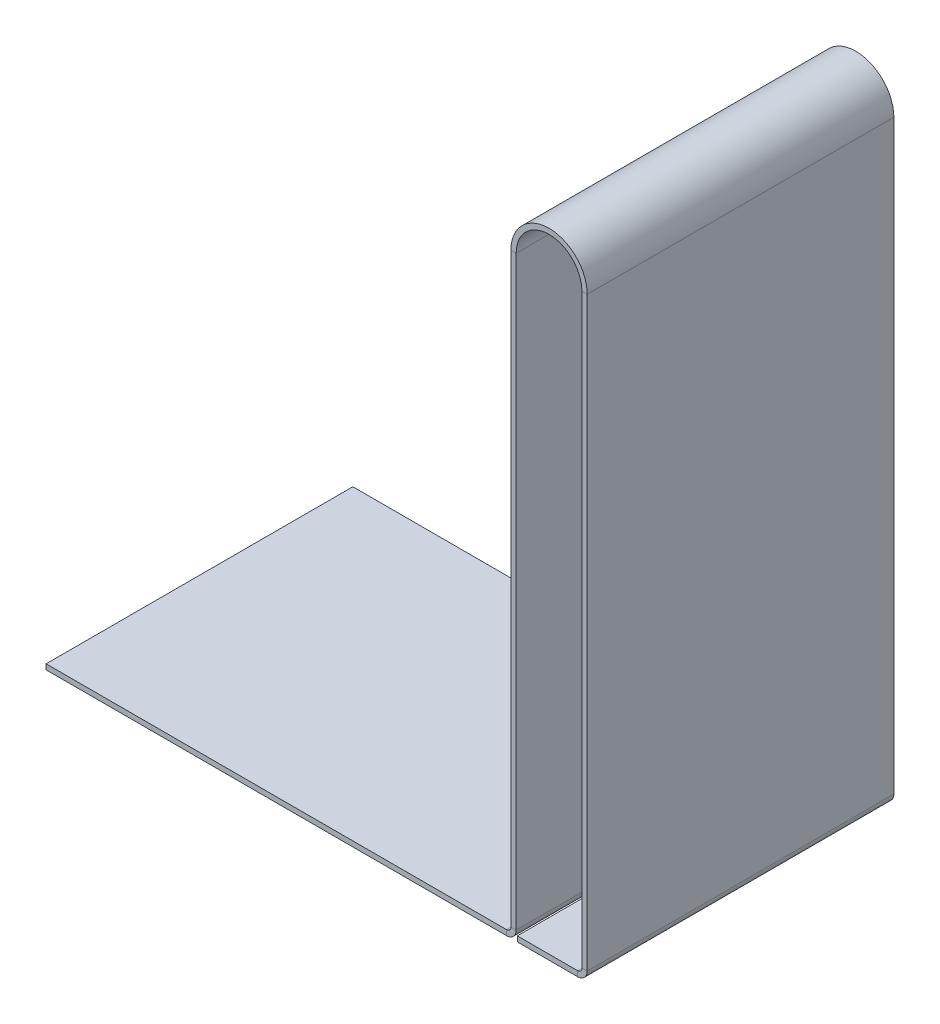
ISO-10303-21;
HEADER;
FILE_DESCRIPTION(('STEP AP214'),'2;1');
FILE_NAME('part.step','',(''),(''),'','','');
FILE_SCHEMA(('AUTOMOTIVE_DESIGN { 1 0 10303 214 1 1 1 1 }'));
ENDSEC;
DATA;
#1=APPLICATION_CONTEXT('core data for automotive mechanical design processes');
#2=APPLICATION_PROTOCOL_DEFINITION('international standard','automotive_design',2000,#1);
#3=PRODUCT_CONTEXT('',#1,'mechanical');
#4=PRODUCT('Part','Part','',(#3));
#5=PRODUCT_RELATED_PRODUCT_CATEGORY('part','',(#4));
#6=PRODUCT_DEFINITION_FORMATION('','',#4);
#7=PRODUCT_DEFINITION_CONTEXT('part definition',#1,'design');
#8=PRODUCT_DEFINITION('design','',#6,#7);
#9=PRODUCT_DEFINITION_SHAPE('','',#8);
#10=(LENGTH_UNIT() NAMED_UNIT(*) SI_UNIT(.MILLI.,.METRE.));
#11=(NAMED_UNIT(*) PLANE_ANGLE_UNIT() SI_UNIT($,.RADIAN.));
#12=(NAMED_UNIT(*) SI_UNIT($,.STERADIAN.) SOLID_ANGLE_UNIT());
#13=UNCERTAINTY_MEASURE_WITH_UNIT(LENGTH_MEASURE(1.E-05),#10,'distance_accuracy_value','');
#14=(GEOMETRIC_REPRESENTATION_CONTEXT(3) GLOBAL_UNCERTAINTY_ASSIGNED_CONTEXT((#13)) GLOBAL_UNIT_ASSIGNED_CONTEXT((#10,
#11,#12)) REPRESENTATION_CONTEXT('',''));
#15=CARTESIAN_POINT('',(0.,0.,0.));
#16=DIRECTION('',(0.,0.,1.));
#17=DIRECTION('',(1.,0.,0.));
#18=AXIS2_PLACEMENT_3D('',#15,#16,#17);
#19=CARTESIAN_POINT('',(-1.2,-75.,-34.99));
#20=DIRECTION('',(0.,0.,-1.));
#21=DIRECTION('',(-1.,0.,0.));
#22=AXIS2_PLACEMENT_3D('',#19,#20,#21);
#23=PLANE('',#22);
#24=DIRECTION('',(0.,1.,0.));
#25=VECTOR('',#24,1.);
#26=CARTESIAN_POINT('',(0.,-75.,-34.99));
#27=LINE('',#26,#25);
#28=CARTESIAN_POINT('',(0.,-58.7433629385641,-34.99));
#29=VERTEX_POINT('',#28);
#30=CARTESIAN_POINT('',(0.,75.,-34.99));
#31=VERTEX_POINT('',#30);
#32=EDGE_CURVE('E287',#29,#31,#27,.T.);
#33=ORIENTED_EDGE('',*,*,#32,.F.);
#34=DIRECTION('',(-1.,0.,0.));
#35=VECTOR('',#34,1.);
#36=CARTESIAN_POINT('',(-1.2,-58.7433629385641,-34.99));
#37=LINE('',#36,#35);
#38=CARTESIAN_POINT('',(-1.2,-58.7433629385641,-34.99));
#39=VERTEX_POINT('',#38);
#40=EDGE_CURVE('E315',#29,#39,#37,.T.);
#41=ORIENTED_EDGE('',*,*,#40,.T.);
#42=DIRECTION('',(0.,1.,0.));
#43=VECTOR('',#42,1.);
#44=CARTESIAN_POINT('',(-1.2,-75.,-34.99));
#45=LINE('',#44,#43);
#46=CARTESIAN_POINT('',(-1.2,75.,-34.99));
#47=VERTEX_POINT('',#46);
#48=EDGE_CURVE('E57',#39,#47,#45,.T.);
#49=ORIENTED_EDGE('',*,*,#48,.T.);
#50=DIRECTION('',(1.,0.,0.));
#51=VECTOR('',#50,1.);
#52=CARTESIAN_POINT('',(-1.2,75.,-34.99));
#53=LINE('',#52,#51);
#54=EDGE_CURVE('E290',#47,#31,#53,.T.);
#55=ORIENTED_EDGE('',*,*,#54,.T.);
#56=EDGE_LOOP('',(#33,#41,#49,#55));
#57=FACE_BOUND('',#56,.T.);
#58=ADVANCED_FACE('F53',(#57),#23,.T.);
#59=CARTESIAN_POINT('',(-1.2,-75.,34.99));
#60=DIRECTION('',(0.,0.,1.));
#61=DIRECTION('',(1.,0.,0.));
#62=AXIS2_PLACEMENT_3D('',#59,#60,#61);
#63=PLANE('',#62);
#64=DIRECTION('',(0.,-1.,0.));
#65=VECTOR('',#64,1.);
#66=CARTESIAN_POINT('',(-1.2,-75.,34.99));
#67=LINE('',#66,#65);
#68=CARTESIAN_POINT('',(-1.2,75.,34.99));
#69=VERTEX_POINT('',#68);
#70=CARTESIAN_POINT('',(-1.2,-58.7433629385641,34.99));
#71=VERTEX_POINT('',#70);
#72=EDGE_CURVE('E286',#69,#71,#67,.T.);
#73=ORIENTED_EDGE('',*,*,#72,.T.);
#74=DIRECTION('',(1.,0.,0.));
#75=VECTOR('',#74,1.);
#76=CARTESIAN_POINT('',(-1.2,-58.7433629385641,34.99));
#77=LINE('',#76,#75);
#78=CARTESIAN_POINT('',(0.,-58.7433629385641,34.99));
#79=VERTEX_POINT('',#78);
#80=EDGE_CURVE('E12',#71,#79,#77,.T.);
#81=ORIENTED_EDGE('',*,*,#80,.T.);
#82=DIRECTION('',(0.,-1.,0.));
#83=VECTOR('',#82,1.);
#84=CARTESIAN_POINT('',(0.,-75.,34.99));
#85=LINE('',#84,#83);
#86=CARTESIAN_POINT('',(0.,75.,34.99));
#87=VERTEX_POINT('',#86);
#88=EDGE_CURVE('E289',#87,#79,#85,.T.);
#89=ORIENTED_EDGE('',*,*,#88,.F.);
#90=DIRECTION('',(1.,0.,0.));
#91=VECTOR('',#90,1.);
#92=CARTESIAN_POINT('',(-1.2,75.,34.99));
#93=LINE('',#92,#91);
#94=EDGE_CURVE('E294',#69,#87,#93,.T.);
#95=ORIENTED_EDGE('',*,*,#94,.F.);
#96=EDGE_LOOP('',(#73,#81,#89,#95));
#97=FACE_BOUND('',#96,.T.);
#98=ADVANCED_FACE('F55',(#97),#63,.T.);
#99=CARTESIAN_POINT('',(0.,0.,0.));
#100=DIRECTION('',(1.,0.,0.));
#101=DIRECTION('',(0.,0.,-1.));
#102=AXIS2_PLACEMENT_3D('',#99,#100,#101);
#103=PLANE('',#102);
#104=ORIENTED_EDGE('',*,*,#88,.T.);
#105=DIRECTION('',(0.,0.,-1.));
#106=VECTOR('',#105,1.);
#107=CARTESIAN_POINT('',(0.,-58.7433629385641,0.));
#108=LINE('',#107,#106);
#109=EDGE_CURVE('E62',#79,#29,#108,.T.);
#110=ORIENTED_EDGE('',*,*,#109,.T.);
#111=ORIENTED_EDGE('',*,*,#32,.T.);
#112=DIRECTION('',(0.,0.,1.));
#113=VECTOR('',#112,1.);
#114=CARTESIAN_POINT('',(0.,75.,34.99));
#115=LINE('',#114,#113);
#116=EDGE_CURVE('E282',#31,#87,#115,.T.);
#117=ORIENTED_EDGE('',*,*,#116,.T.);
#118=EDGE_LOOP('',(#104,#110,#111,#117));
#119=FACE_BOUND('',#118,.T.);
#120=ADVANCED_FACE('F325',(#119),#103,.T.);
#121=CARTESIAN_POINT('',(-17.4,-45.65,0.));
#122=DIRECTION('',(-1.,0.,0.));
#123=DIRECTION('',(0.,0.,1.));
#124=AXIS2_PLACEMENT_3D('',#121,#122,#123);
#125=PLANE('',#124);
#126=DIRECTION('',(0.,1.,0.));
#127=VECTOR('',#126,1.);
#128=CARTESIAN_POINT('',(-17.4,-45.65,-34.99));
#129=LINE('',#128,#127);
#130=CARTESIAN_POINT('',(-17.4,-58.74,-34.99));
#131=VERTEX_POINT('',#130);
#132=CARTESIAN_POINT('',(-17.4,75.,-34.99));
#133=VERTEX_POINT('',#132);
#134=EDGE_CURVE('E271',#131,#133,#129,.T.);
#135=ORIENTED_EDGE('',*,*,#134,.F.);
#136=DIRECTION('',(0.,0.,1.));
#137=VECTOR('',#136,1.);
#138=CARTESIAN_POINT('',(-17.4,-58.74,0.));
#139=LINE('',#138,#137);
#140=CARTESIAN_POINT('',(-17.4,-58.74,34.99));
#141=VERTEX_POINT('',#140);
#142=EDGE_CURVE('E301',#131,#141,#139,.T.);
#143=ORIENTED_EDGE('',*,*,#142,.T.);
#144=DIRECTION('',(0.,-1.,0.));
#145=VECTOR('',#144,1.);
#146=CARTESIAN_POINT('',(-17.4,-45.65,34.99));
#147=LINE('',#146,#145);
#148=CARTESIAN_POINT('',(-17.4,75.,34.99));
#149=VERTEX_POINT('',#148);
#150=EDGE_CURVE('E272',#149,#141,#147,.T.);
#151=ORIENTED_EDGE('',*,*,#150,.F.);
#152=DIRECTION('',(0.,0.,1.));
#153=VECTOR('',#152,1.);
#154=CARTESIAN_POINT('',(-17.4,75.,0.));
#155=LINE('',#154,#153);
#156=EDGE_CURVE('E268',#133,#149,#155,.T.);
#157=ORIENTED_EDGE('',*,*,#156,.F.);
#158=EDGE_LOOP('',(#135,#143,#151,#157));
#159=FACE_BOUND('',#158,.T.);
#160=ADVANCED_FACE('F376',(#159),#125,.T.);
#161=CARTESIAN_POINT('',(-17.4,-45.65,34.99));
#162=DIRECTION('',(0.,0.,-1.));
#163=DIRECTION('',(0.,-1.,0.));
#164=AXIS2_PLACEMENT_3D('',#161,#162,#163);
#165=PLANE('',#164);
#166=ORIENTED_EDGE('',*,*,#150,.T.);
#167=DIRECTION('',(1.,0.,0.));
#168=VECTOR('',#167,1.);
#169=CARTESIAN_POINT('',(-17.4,-58.74,34.99));
#170=LINE('',#169,#168);
#171=CARTESIAN_POINT('',(-16.2,-58.74,34.99));
#172=VERTEX_POINT('',#171);
#173=EDGE_CURVE('E298',#141,#172,#170,.T.);
#174=ORIENTED_EDGE('',*,*,#173,.T.);
#175=DIRECTION('',(0.,1.,0.));
#176=VECTOR('',#175,1.);
#177=CARTESIAN_POINT('',(-16.2,-45.65,34.99));
#178=LINE('',#177,#176);
#179=CARTESIAN_POINT('',(-16.2,75.,34.99));
#180=VERTEX_POINT('',#179);
#181=EDGE_CURVE('E259',#180,#172,#178,.F.);
#182=ORIENTED_EDGE('',*,*,#181,.F.);
#183=DIRECTION('',(-1.,0.,0.));
#184=VECTOR('',#183,1.);
#185=CARTESIAN_POINT('',(-17.4,75.,34.99));
#186=LINE('',#185,#184);
#187=EDGE_CURVE('E279',#180,#149,#186,.T.);
#188=ORIENTED_EDGE('',*,*,#187,.T.);
#189=EDGE_LOOP('',(#166,#174,#182,#188));
#190=FACE_BOUND('',#189,.T.);
#191=ADVANCED_FACE('F381',(#190),#165,.F.);
#192=CARTESIAN_POINT('',(-17.4,-45.65,-34.99));
#193=DIRECTION('',(0.,0.,1.));
#194=DIRECTION('',(0.,1.,0.));
#195=AXIS2_PLACEMENT_3D('',#192,#193,#194);
#196=PLANE('',#195);
#197=DIRECTION('',(0.,1.,0.));
#198=VECTOR('',#197,1.);
#199=CARTESIAN_POINT('',(-16.2,-45.65,-34.99));
#200=LINE('',#199,#198);
#201=CARTESIAN_POINT('',(-16.2,-58.74,-34.99));
#202=VERTEX_POINT('',#201);
#203=CARTESIAN_POINT('',(-16.2,75.,-34.99));
#204=VERTEX_POINT('',#203);
#205=EDGE_CURVE('E275',#202,#204,#200,.T.);
#206=ORIENTED_EDGE('',*,*,#205,.F.);
#207=DIRECTION('',(-1.,0.,0.));
#208=VECTOR('',#207,1.);
#209=CARTESIAN_POINT('',(-17.4,-58.74,-34.99));
#210=LINE('',#209,#208);
#211=EDGE_CURVE('E304',#202,#131,#210,.T.);
#212=ORIENTED_EDGE('',*,*,#211,.T.);
#213=ORIENTED_EDGE('',*,*,#134,.T.);
#214=DIRECTION('',(-1.,0.,0.));
#215=VECTOR('',#214,1.);
#216=CARTESIAN_POINT('',(-17.4,75.,-34.99));
#217=LINE('',#216,#215);
#218=EDGE_CURVE('E276',#204,#133,#217,.T.);
#219=ORIENTED_EDGE('',*,*,#218,.F.);
#220=EDGE_LOOP('',(#206,#212,#213,#219));
#221=FACE_BOUND('',#220,.T.);
#222=ADVANCED_FACE('F388',(#221),#196,.F.);
#223=CARTESIAN_POINT('',(-1.2,0.,0.));
#224=DIRECTION('',(1.,0.,0.));
#225=DIRECTION('',(0.,0.,-1.));
#226=AXIS2_PLACEMENT_3D('',#223,#224,#225);
#227=PLANE('',#226);
#228=DIRECTION('',(0.,0.,-1.));
#229=VECTOR('',#228,1.);
#230=CARTESIAN_POINT('',(-1.2,-58.7433629385641,0.));
#231=LINE('',#230,#229);
#232=EDGE_CURVE('E307',#71,#39,#231,.T.);
#233=ORIENTED_EDGE('',*,*,#232,.F.);
#234=ORIENTED_EDGE('',*,*,#72,.F.);
#235=DIRECTION('',(0.,0.,1.));
#236=VECTOR('',#235,1.);
#237=CARTESIAN_POINT('',(-1.2,75.,34.99));
#238=LINE('',#237,#236);
#239=EDGE_CURVE('E283',#47,#69,#238,.T.);
#240=ORIENTED_EDGE('',*,*,#239,.F.);
#241=ORIENTED_EDGE('',*,*,#48,.F.);
#242=EDGE_LOOP('',(#233,#234,#240,#241));
#243=FACE_BOUND('',#242,.T.);
#244=ADVANCED_FACE('F337',(#243),#227,.F.);
#245=CARTESIAN_POINT('',(-16.2,-45.65,0.));
#246=DIRECTION('',(-1.,0.,0.));
#247=DIRECTION('',(0.,0.,1.));
#248=AXIS2_PLACEMENT_3D('',#245,#246,#247);
#249=PLANE('',#248);
#250=DIRECTION('',(0.,0.,1.));
#251=VECTOR('',#250,1.);
#252=CARTESIAN_POINT('',(-16.2,-58.74,0.));
#253=LINE('',#252,#251);
#254=EDGE_CURVE('E293',#202,#172,#253,.T.);
#255=ORIENTED_EDGE('',*,*,#254,.F.);
#256=ORIENTED_EDGE('',*,*,#205,.T.);
#257=DIRECTION('',(0.,0.,1.));
#258=VECTOR('',#257,1.);
#259=CARTESIAN_POINT('',(-16.2,75.,0.));
#260=LINE('',#259,#258);
#261=EDGE_CURVE('E273',#204,#180,#260,.T.);
#262=ORIENTED_EDGE('',*,*,#261,.T.);
#263=ORIENTED_EDGE('',*,*,#181,.T.);
#264=EDGE_LOOP('',(#255,#256,#262,#263));
#265=FACE_BOUND('',#264,.T.);
#266=ADVANCED_FACE('F398',(#265),#249,.F.);
#267=CARTESIAN_POINT('',(-8.7,75.,34.99));
#268=DIRECTION('',(0.,0.,1.));
#269=DIRECTION('',(1.,0.,0.));
#270=AXIS2_PLACEMENT_3D('',#267,#268,#269);
#271=PLANE('',#270);
#272=ORIENTED_EDGE('',*,*,#187,.F.);
#273=CARTESIAN_POINT('',(-8.7,75.,34.99));
#274=DIRECTION('',(0.,0.,-1.));
#275=DIRECTION('',(-1.,0.,0.));
#276=AXIS2_PLACEMENT_3D('',#273,#274,#275);
#277=CIRCLE('',#276,7.5);
#278=EDGE_CURVE('E263',#69,#180,#277,.F.);
#279=ORIENTED_EDGE('',*,*,#278,.F.);
#280=ORIENTED_EDGE('',*,*,#94,.T.);
#281=CARTESIAN_POINT('',(-8.7,75.,34.99));
#282=DIRECTION('',(0.,0.,-1.));
#283=DIRECTION('',(-1.,0.,0.));
#284=AXIS2_PLACEMENT_3D('',#281,#282,#283);
#285=CIRCLE('',#284,8.7);
#286=EDGE_CURVE('E256',#87,#149,#285,.F.);
#287=ORIENTED_EDGE('',*,*,#286,.T.);
#288=EDGE_LOOP('',(#272,#279,#280,#287));
#289=FACE_BOUND('',#288,.T.);
#290=ADVANCED_FACE('F464',(#289),#271,.T.);
#291=CARTESIAN_POINT('',(-8.7,75.,-34.99));
#292=DIRECTION('',(0.,0.,1.));
#293=DIRECTION('',(1.,0.,0.));
#294=AXIS2_PLACEMENT_3D('',#291,#292,#293);
#295=PLANE('',#294);
#296=CARTESIAN_POINT('',(-8.7,75.,-34.99));
#297=DIRECTION('',(0.,0.,-1.));
#298=DIRECTION('',(-1.,0.,0.));
#299=AXIS2_PLACEMENT_3D('',#296,#297,#298);
#300=CIRCLE('',#299,7.5);
#301=EDGE_CURVE('E252',#204,#47,#300,.T.);
#302=ORIENTED_EDGE('',*,*,#301,.F.);
#303=ORIENTED_EDGE('',*,*,#218,.T.);
#304=CARTESIAN_POINT('',(-8.7,75.,-34.99));
#305=DIRECTION('',(0.,0.,-1.));
#306=DIRECTION('',(-1.,0.,0.));
#307=AXIS2_PLACEMENT_3D('',#304,#305,#306);
#308=CIRCLE('',#307,8.7);
#309=EDGE_CURVE('E260',#133,#31,#308,.T.);
#310=ORIENTED_EDGE('',*,*,#309,.T.);
#311=ORIENTED_EDGE('',*,*,#54,.F.);
#312=EDGE_LOOP('',(#302,#303,#310,#311));
#313=FACE_BOUND('',#312,.T.);
#314=ADVANCED_FACE('F460',(#313),#295,.F.);
#315=CARTESIAN_POINT('',(-8.7,75.,-34.99));
#316=DIRECTION('',(0.,0.,-1.));
#317=DIRECTION('',(-1.,0.,0.));
#318=AXIS2_PLACEMENT_3D('',#315,#316,#317);
#319=CYLINDRICAL_SURFACE('',#318,8.7);
#320=ORIENTED_EDGE('',*,*,#116,.F.);
#321=ORIENTED_EDGE('',*,*,#309,.F.);
#322=ORIENTED_EDGE('',*,*,#156,.T.);
#323=ORIENTED_EDGE('',*,*,#286,.F.);
#324=EDGE_LOOP('',(#320,#321,#322,#323));
#325=FACE_BOUND('',#324,.T.);
#326=ADVANCED_FACE('F457',(#325),#319,.T.);
#327=CARTESIAN_POINT('',(-8.7,75.,-34.99));
#328=DIRECTION('',(0.,0.,-1.));
#329=DIRECTION('',(-1.,0.,0.));
#330=AXIS2_PLACEMENT_3D('',#327,#328,#329);
#331=CYLINDRICAL_SURFACE('',#330,7.5);
#332=ORIENTED_EDGE('',*,*,#239,.T.);
#333=ORIENTED_EDGE('',*,*,#278,.T.);
#334=ORIENTED_EDGE('',*,*,#261,.F.);
#335=ORIENTED_EDGE('',*,*,#301,.T.);
#336=EDGE_LOOP('',(#332,#333,#334,#335));
#337=FACE_BOUND('',#336,.T.);
#338=ADVANCED_FACE('F454',(#337),#331,.F.);
#339=CARTESIAN_POINT('',(-18.4,-58.74,-34.99));
#340=DIRECTION('',(0.,0.,-1.));
#341=DIRECTION('',(-1.,0.,0.));
#342=AXIS2_PLACEMENT_3D('',#339,#340,#341);
#343=PLANE('',#342);
#344=DIRECTION('',(0.,1.,0.));
#345=VECTOR('',#344,1.);
#346=CARTESIAN_POINT('',(-18.4,-59.74,-34.99));
#347=LINE('',#346,#345);
#348=CARTESIAN_POINT('',(-18.4,-60.94,-34.99));
#349=VERTEX_POINT('',#348);
#350=CARTESIAN_POINT('',(-18.4,-59.74,-34.99));
#351=VERTEX_POINT('',#350);
#352=EDGE_CURVE('E212',#349,#351,#347,.T.);
#353=ORIENTED_EDGE('',*,*,#352,.T.);
#354=CARTESIAN_POINT('',(-18.4,-58.74,-34.99));
#355=DIRECTION('',(0.,0.,-1.));
#356=DIRECTION('',(0.,1.,0.));
#357=AXIS2_PLACEMENT_3D('',#354,#355,#356);
#358=CIRCLE('',#357,1.);
#359=EDGE_CURVE('E78',#351,#131,#358,.F.);
#360=ORIENTED_EDGE('',*,*,#359,.T.);
#361=ORIENTED_EDGE('',*,*,#211,.F.);
#362=CARTESIAN_POINT('',(-18.4,-58.74,-34.99));
#363=DIRECTION('',(0.,0.,1.));
#364=DIRECTION('',(1.,0.,0.));
#365=AXIS2_PLACEMENT_3D('',#362,#363,#364);
#366=CIRCLE('',#365,2.2);
#367=EDGE_CURVE('E245',#349,#202,#366,.T.);
#368=ORIENTED_EDGE('',*,*,#367,.F.);
#369=EDGE_LOOP('',(#353,#360,#361,#368));
#370=FACE_BOUND('',#369,.T.);
#371=ADVANCED_FACE('F425',(#370),#343,.T.);
#372=CARTESIAN_POINT('',(-18.4,-58.74,34.99));
#373=DIRECTION('',(0.,0.,1.));
#374=DIRECTION('',(1.,0.,0.));
#375=AXIS2_PLACEMENT_3D('',#372,#373,#374);
#376=PLANE('',#375);
#377=CARTESIAN_POINT('',(-18.4,-58.74,34.99));
#378=DIRECTION('',(0.,0.,-1.));
#379=DIRECTION('',(0.,1.,0.));
#380=AXIS2_PLACEMENT_3D('',#377,#378,#379);
#381=CIRCLE('',#380,1.);
#382=CARTESIAN_POINT('',(-18.4,-59.74,34.99));
#383=VERTEX_POINT('',#382);
#384=EDGE_CURVE('E249',#141,#383,#381,.T.);
#385=ORIENTED_EDGE('',*,*,#384,.T.);
#386=DIRECTION('',(0.,-1.,0.));
#387=VECTOR('',#386,1.);
#388=CARTESIAN_POINT('',(-18.4,-59.74,34.99));
#389=LINE('',#388,#387);
#390=CARTESIAN_POINT('',(-18.4,-60.94,34.99));
#391=VERTEX_POINT('',#390);
#392=EDGE_CURVE('E238',#383,#391,#389,.T.);
#393=ORIENTED_EDGE('',*,*,#392,.T.);
#394=CARTESIAN_POINT('',(-18.4,-58.74,34.99));
#395=DIRECTION('',(0.,0.,-1.));
#396=DIRECTION('',(-1.,0.,0.));
#397=AXIS2_PLACEMENT_3D('',#394,#395,#396);
#398=CIRCLE('',#397,2.2);
#399=EDGE_CURVE('E248',#172,#391,#398,.T.);
#400=ORIENTED_EDGE('',*,*,#399,.F.);
#401=ORIENTED_EDGE('',*,*,#173,.F.);
#402=EDGE_LOOP('',(#385,#393,#400,#401));
#403=FACE_BOUND('',#402,.T.);
#404=ADVANCED_FACE('F411',(#403),#376,.T.);
#405=CARTESIAN_POINT('',(-18.4,-58.74,70.0353978129396));
#406=DIRECTION('',(0.,0.,-1.));
#407=DIRECTION('',(0.,1.,0.));
#408=AXIS2_PLACEMENT_3D('',#405,#406,#407);
#409=CYLINDRICAL_SURFACE('',#408,2.2);
#410=ORIENTED_EDGE('',*,*,#254,.T.);
#411=ORIENTED_EDGE('',*,*,#399,.T.);
#412=DIRECTION('',(0.,0.,1.));
#413=VECTOR('',#412,1.);
#414=CARTESIAN_POINT('',(-18.4,-60.94,0.));
#415=LINE('',#414,#413);
#416=EDGE_CURVE('E227',#349,#391,#415,.T.);
#417=ORIENTED_EDGE('',*,*,#416,.F.);
#418=ORIENTED_EDGE('',*,*,#367,.T.);
#419=EDGE_LOOP('',(#410,#411,#417,#418));
#420=FACE_BOUND('',#419,.T.);
#421=ADVANCED_FACE('F407',(#420),#409,.T.);
#422=CARTESIAN_POINT('',(-18.4,-58.74,70.0353978129396));
#423=DIRECTION('',(0.,0.,-1.));
#424=DIRECTION('',(0.,1.,0.));
#425=AXIS2_PLACEMENT_3D('',#422,#423,#424);
#426=CYLINDRICAL_SURFACE('',#425,1.);
#427=ORIENTED_EDGE('',*,*,#142,.F.);
#428=ORIENTED_EDGE('',*,*,#359,.F.);
#429=DIRECTION('',(0.,0.,1.));
#430=VECTOR('',#429,1.);
#431=CARTESIAN_POINT('',(-18.4,-59.74,0.));
#432=LINE('',#431,#430);
#433=EDGE_CURVE('E241',#351,#383,#432,.T.);
#434=ORIENTED_EDGE('',*,*,#433,.T.);
#435=ORIENTED_EDGE('',*,*,#384,.F.);
#436=EDGE_LOOP('',(#427,#428,#434,#435));
#437=FACE_BOUND('',#436,.T.);
#438=ADVANCED_FACE('F420',(#437),#426,.F.);
#439=CARTESIAN_POINT('',(-123.446725877128,-59.7399999999997,0.));
#440=DIRECTION('',(1.,0.,0.));
#441=DIRECTION('',(0.,0.,-1.));
#442=AXIS2_PLACEMENT_3D('',#439,#440,#441);
#443=PLANE('',#442);
#444=DIRECTION('',(0.,1.,0.));
#445=VECTOR('',#444,1.);
#446=CARTESIAN_POINT('',(-123.446725877128,-59.7399999999997,-34.9900000000001));
#447=LINE('',#446,#445);
#448=CARTESIAN_POINT('',(-123.446725877128,-60.9399999999997,-34.9900000000001));
#449=VERTEX_POINT('',#448);
#450=CARTESIAN_POINT('',(-123.446725877128,-59.7399999999997,-34.9900000000001));
#451=VERTEX_POINT('',#450);
#452=EDGE_CURVE('E218',#449,#451,#447,.T.);
#453=ORIENTED_EDGE('',*,*,#452,.F.);
#454=DIRECTION('',(0.,0.,1.));
#455=VECTOR('',#454,1.);
#456=CARTESIAN_POINT('',(-123.446725877128,-60.9399999999997,0.));
#457=LINE('',#456,#455);
#458=CARTESIAN_POINT('',(-123.446725877128,-60.9399999999996,34.9899999999999));
#459=VERTEX_POINT('',#458);
#460=EDGE_CURVE('E222',#459,#449,#457,.F.);
#461=ORIENTED_EDGE('',*,*,#460,.F.);
#462=DIRECTION('',(0.,1.,0.));
#463=VECTOR('',#462,1.);
#464=CARTESIAN_POINT('',(-123.446725877128,-59.7399999999997,34.9899999999999));
#465=LINE('',#464,#463);
#466=CARTESIAN_POINT('',(-123.446725877128,-59.7399999999997,34.9899999999999));
#467=VERTEX_POINT('',#466);
#468=EDGE_CURVE('E235',#459,#467,#465,.T.);
#469=ORIENTED_EDGE('',*,*,#468,.T.);
#470=DIRECTION('',(0.,0.,-1.));
#471=VECTOR('',#470,1.);
#472=CARTESIAN_POINT('',(-123.446725877128,-59.7399999999997,0.));
#473=LINE('',#472,#471);
#474=EDGE_CURVE('E232',#467,#451,#473,.T.);
#475=ORIENTED_EDGE('',*,*,#474,.T.);
#476=EDGE_LOOP('',(#453,#461,#469,#475));
#477=FACE_BOUND('',#476,.T.);
#478=ADVANCED_FACE('F433',(#477),#443,.F.);
#479=CARTESIAN_POINT('',(-2.79672587712815,-60.9400000000001,0.));
#480=DIRECTION('',(0.,1.,0.));
#481=DIRECTION('',(0.,0.,1.));
#482=AXIS2_PLACEMENT_3D('',#479,#480,#481);
#483=PLANE('',#482);
#484=DIRECTION('',(1.,0.,0.));
#485=VECTOR('',#484,1.);
#486=CARTESIAN_POINT('',(-2.79672587712815,-60.9400000000001,-34.99));
#487=LINE('',#486,#485);
#488=EDGE_CURVE('E229',#449,#349,#487,.T.);
#489=ORIENTED_EDGE('',*,*,#488,.T.);
#490=ORIENTED_EDGE('',*,*,#416,.T.);
#491=DIRECTION('',(1.,0.,0.));
#492=VECTOR('',#491,1.);
#493=CARTESIAN_POINT('',(-2.79672587712816,-60.9400000000001,34.99));
#494=LINE('',#493,#492);
#495=EDGE_CURVE('E225',#391,#459,#494,.F.);
#496=ORIENTED_EDGE('',*,*,#495,.T.);
#497=ORIENTED_EDGE('',*,*,#460,.T.);
#498=EDGE_LOOP('',(#489,#490,#496,#497));
#499=FACE_BOUND('',#498,.T.);
#500=ADVANCED_FACE('F430',(#499),#483,.F.);
#501=CARTESIAN_POINT('',(-2.79672587712816,-59.7400000000001,34.99));
#502=DIRECTION('',(0.,0.,-1.));
#503=DIRECTION('',(-1.,0.,0.));
#504=AXIS2_PLACEMENT_3D('',#501,#502,#503);
#505=PLANE('',#504);
#506=ORIENTED_EDGE('',*,*,#392,.F.);
#507=DIRECTION('',(-1.,0.,0.));
#508=VECTOR('',#507,1.);
#509=CARTESIAN_POINT('',(-2.79672587712816,-59.7400000000001,34.99));
#510=LINE('',#509,#508);
#511=EDGE_CURVE('E220',#383,#467,#510,.T.);
#512=ORIENTED_EDGE('',*,*,#511,.T.);
#513=ORIENTED_EDGE('',*,*,#468,.F.);
#514=ORIENTED_EDGE('',*,*,#495,.F.);
#515=EDGE_LOOP('',(#506,#512,#513,#514));
#516=FACE_BOUND('',#515,.T.);
#517=ADVANCED_FACE('F416',(#516),#505,.F.);
#518=CARTESIAN_POINT('',(-2.79672587712815,-59.7400000000001,0.));
#519=DIRECTION('',(0.,1.,0.));
#520=DIRECTION('',(0.,0.,1.));
#521=AXIS2_PLACEMENT_3D('',#518,#519,#520);
#522=PLANE('',#521);
#523=ORIENTED_EDGE('',*,*,#433,.F.);
#524=DIRECTION('',(1.,0.,0.));
#525=VECTOR('',#524,1.);
#526=CARTESIAN_POINT('',(-2.79672587712813,-59.7400000000001,-34.99));
#527=LINE('',#526,#525);
#528=EDGE_CURVE('E216',#451,#351,#527,.T.);
#529=ORIENTED_EDGE('',*,*,#528,.F.);
#530=ORIENTED_EDGE('',*,*,#474,.F.);
#531=ORIENTED_EDGE('',*,*,#511,.F.);
#532=EDGE_LOOP('',(#523,#529,#530,#531));
#533=FACE_BOUND('',#532,.T.);
#534=ADVANCED_FACE('F423',(#533),#522,.T.);
#535=CARTESIAN_POINT('',(-2.79672587712813,-59.7400000000001,-34.99));
#536=DIRECTION('',(0.,0.,1.));
#537=DIRECTION('',(1.,0.,0.));
#538=AXIS2_PLACEMENT_3D('',#535,#536,#537);
#539=PLANE('',#538);
#540=ORIENTED_EDGE('',*,*,#352,.F.);
#541=ORIENTED_EDGE('',*,*,#488,.F.);
#542=ORIENTED_EDGE('',*,*,#452,.T.);
#543=ORIENTED_EDGE('',*,*,#528,.T.);
#544=EDGE_LOOP('',(#540,#541,#542,#543));
#545=FACE_BOUND('',#544,.T.);
#546=ADVANCED_FACE('F428',(#545),#539,.F.);
#547=CARTESIAN_POINT('',(-2.2,-58.7433629385641,34.99));
#548=DIRECTION('',(0.,0.,-1.));
#549=DIRECTION('',(-1.,0.,0.));
#550=AXIS2_PLACEMENT_3D('',#547,#548,#549);
#551=PLANE('',#550);
#552=DIRECTION('',(0.,-1.,0.));
#553=VECTOR('',#552,1.);
#554=CARTESIAN_POINT('',(-2.2,-59.7433629385641,34.99));
#555=LINE('',#554,#553);
#556=CARTESIAN_POINT('',(-2.2,-59.7433629385641,34.99));
#557=VERTEX_POINT('',#556);
#558=CARTESIAN_POINT('',(-2.20000000000001,-60.9433629385641,34.99));
#559=VERTEX_POINT('',#558);
#560=EDGE_CURVE('E175',#557,#559,#555,.T.);
#561=ORIENTED_EDGE('',*,*,#560,.T.);
#562=CARTESIAN_POINT('',(-2.2,-58.7433629385641,34.99));
#563=DIRECTION('',(0.,0.,1.));
#564=DIRECTION('',(1.,0.,0.));
#565=AXIS2_PLACEMENT_3D('',#562,#563,#564);
#566=CIRCLE('',#565,2.2);
#567=EDGE_CURVE('E70',#559,#79,#566,.T.);
#568=ORIENTED_EDGE('',*,*,#567,.T.);
#569=ORIENTED_EDGE('',*,*,#80,.F.);
#570=CARTESIAN_POINT('',(-2.2,-58.7433629385641,34.99));
#571=DIRECTION('',(0.,0.,1.));
#572=DIRECTION('',(-1.,0.,0.));
#573=AXIS2_PLACEMENT_3D('',#570,#571,#572);
#574=CIRCLE('',#573,1.);
#575=EDGE_CURVE('E205',#557,#71,#574,.T.);
#576=ORIENTED_EDGE('',*,*,#575,.F.);
#577=EDGE_LOOP('',(#561,#568,#569,#576));
#578=FACE_BOUND('',#577,.T.);
#579=ADVANCED_FACE('F329',(#578),#551,.F.);
#580=CARTESIAN_POINT('',(-2.2,-58.7433629385641,-34.99));
#581=DIRECTION('',(0.,0.,1.));
#582=DIRECTION('',(1.,0.,0.));
#583=AXIS2_PLACEMENT_3D('',#580,#581,#582);
#584=PLANE('',#583);
#585=ORIENTED_EDGE('',*,*,#40,.F.);
#586=CARTESIAN_POINT('',(-2.2,-58.7433629385641,-34.99));
#587=DIRECTION('',(0.,0.,1.));
#588=DIRECTION('',(1.,0.,0.));
#589=AXIS2_PLACEMENT_3D('',#586,#587,#588);
#590=CIRCLE('',#589,2.2);
#591=CARTESIAN_POINT('',(-2.20000000000001,-60.9433629385641,-34.99));
#592=VERTEX_POINT('',#591);
#593=EDGE_CURVE('E209',#29,#592,#590,.F.);
#594=ORIENTED_EDGE('',*,*,#593,.T.);
#595=DIRECTION('',(0.,1.,0.));
#596=VECTOR('',#595,1.);
#597=CARTESIAN_POINT('',(-2.2,-59.7433629385641,-34.99));
#598=LINE('',#597,#596);
#599=CARTESIAN_POINT('',(-2.2,-59.7433629385641,-34.99));
#600=VERTEX_POINT('',#599);
#601=EDGE_CURVE('E193',#592,#600,#598,.T.);
#602=ORIENTED_EDGE('',*,*,#601,.T.);
#603=CARTESIAN_POINT('',(-2.2,-58.7433629385641,-34.99));
#604=DIRECTION('',(0.,0.,-1.));
#605=DIRECTION('',(1.,0.,0.));
#606=AXIS2_PLACEMENT_3D('',#603,#604,#605);
#607=CIRCLE('',#606,1.);
#608=EDGE_CURVE('E208',#39,#600,#607,.T.);
#609=ORIENTED_EDGE('',*,*,#608,.F.);
#610=EDGE_LOOP('',(#585,#594,#602,#609));
#611=FACE_BOUND('',#610,.T.);
#612=ADVANCED_FACE('F344',(#611),#584,.F.);
#613=CARTESIAN_POINT('',(-2.2,-58.7433629385641,-70.0353978129396));
#614=DIRECTION('',(0.,0.,1.));
#615=DIRECTION('',(1.,0.,0.));
#616=AXIS2_PLACEMENT_3D('',#613,#614,#615);
#617=CYLINDRICAL_SURFACE('',#616,1.);
#618=ORIENTED_EDGE('',*,*,#608,.T.);
#619=DIRECTION('',(0.,0.,-1.));
#620=VECTOR('',#619,1.);
#621=CARTESIAN_POINT('',(-2.2,-59.7433629385641,0.));
#622=LINE('',#621,#620);
#623=EDGE_CURVE('E195',#557,#600,#622,.T.);
#624=ORIENTED_EDGE('',*,*,#623,.F.);
#625=ORIENTED_EDGE('',*,*,#575,.T.);
#626=ORIENTED_EDGE('',*,*,#232,.T.);
#627=EDGE_LOOP('',(#618,#624,#625,#626));
#628=FACE_BOUND('',#627,.T.);
#629=ADVANCED_FACE('F333',(#628),#617,.F.);
#630=CARTESIAN_POINT('',(-2.2,-58.7433629385641,-70.0353978129396));
#631=DIRECTION('',(0.,0.,1.));
#632=DIRECTION('',(1.,0.,0.));
#633=AXIS2_PLACEMENT_3D('',#630,#631,#632);
#634=CYLINDRICAL_SURFACE('',#633,2.2);
#635=ORIENTED_EDGE('',*,*,#593,.F.);
#636=ORIENTED_EDGE('',*,*,#109,.F.);
#637=ORIENTED_EDGE('',*,*,#567,.F.);
#638=DIRECTION('',(0.,0.,-1.));
#639=VECTOR('',#638,1.);
#640=CARTESIAN_POINT('',(-2.20000000000001,-60.9433629385641,0.));
#641=LINE('',#640,#639);
#642=EDGE_CURVE('E198',#559,#592,#641,.T.);
#643=ORIENTED_EDGE('',*,*,#642,.T.);
#644=EDGE_LOOP('',(#635,#636,#637,#643));
#645=FACE_BOUND('',#644,.T.);
#646=ADVANCED_FACE('F346',(#645),#634,.T.);
#647=CARTESIAN_POINT('',(-15.9433629385641,-59.7433629385641,34.99));
#648=DIRECTION('',(-1.,0.,0.));
#649=DIRECTION('',(0.,0.,-1.));
#650=AXIS2_PLACEMENT_3D('',#647,#648,#649);
#651=PLANE('',#650);
#652=DIRECTION('',(0.,0.,-1.));
#653=VECTOR('',#652,1.);
#654=CARTESIAN_POINT('',(-15.9433629385641,-60.9433629385641,34.99));
#655=LINE('',#654,#653);
#656=CARTESIAN_POINT('',(-15.9433629385641,-60.9433629385641,34.99));
#657=VERTEX_POINT('',#656);
#658=CARTESIAN_POINT('',(-15.9433629385641,-60.9433629385641,-34.99));
#659=VERTEX_POINT('',#658);
#660=EDGE_CURVE('E188',#657,#659,#655,.T.);
#661=ORIENTED_EDGE('',*,*,#660,.F.);
#662=DIRECTION('',(0.,-1.,0.));
#663=VECTOR('',#662,1.);
#664=CARTESIAN_POINT('',(-15.9433629385641,-59.7433629385641,34.99));
#665=LINE('',#664,#663);
#666=CARTESIAN_POINT('',(-15.9433629385641,-59.7433629385641,34.99));
#667=VERTEX_POINT('',#666);
#668=EDGE_CURVE('E173',#667,#657,#665,.T.);
#669=ORIENTED_EDGE('',*,*,#668,.F.);
#670=DIRECTION('',(0.,0.,-1.));
#671=VECTOR('',#670,1.);
#672=CARTESIAN_POINT('',(-15.9433629385641,-59.7433629385641,34.99));
#673=LINE('',#672,#671);
#674=CARTESIAN_POINT('',(-15.9433629385641,-59.7433629385641,-34.99));
#675=VERTEX_POINT('',#674);
#676=EDGE_CURVE('E185',#667,#675,#673,.T.);
#677=ORIENTED_EDGE('',*,*,#676,.T.);
#678=DIRECTION('',(0.,-1.,0.));
#679=VECTOR('',#678,1.);
#680=CARTESIAN_POINT('',(-15.9433629385641,-59.7433629385641,-34.99));
#681=LINE('',#680,#679);
#682=EDGE_CURVE('E192',#675,#659,#681,.T.);
#683=ORIENTED_EDGE('',*,*,#682,.T.);
#684=EDGE_LOOP('',(#661,#669,#677,#683));
#685=FACE_BOUND('',#684,.T.);
#686=ADVANCED_FACE('F184',(#685),#651,.T.);
#687=CARTESIAN_POINT('',(59.056637061436,-59.7433629385643,0.));
#688=DIRECTION('',(0.,-1.,0.));
#689=DIRECTION('',(0.,0.,-1.));
#690=AXIS2_PLACEMENT_3D('',#687,#688,#689);
#691=PLANE('',#690);
#692=DIRECTION('',(-1.,0.,0.));
#693=VECTOR('',#692,1.);
#694=CARTESIAN_POINT('',(-15.9433629385641,-59.7433629385641,34.99));
#695=LINE('',#694,#693);
#696=EDGE_CURVE('E170',#557,#667,#695,.T.);
#697=ORIENTED_EDGE('',*,*,#696,.F.);
#698=ORIENTED_EDGE('',*,*,#623,.T.);
#699=DIRECTION('',(1.,0.,0.));
#700=VECTOR('',#699,1.);
#701=CARTESIAN_POINT('',(-15.9433629385641,-59.7433629385641,-34.99));
#702=LINE('',#701,#700);
#703=EDGE_CURVE('E191',#675,#600,#702,.T.);
#704=ORIENTED_EDGE('',*,*,#703,.F.);
#705=ORIENTED_EDGE('',*,*,#676,.F.);
#706=EDGE_LOOP('',(#697,#698,#704,#705));
#707=FACE_BOUND('',#706,.T.);
#708=ADVANCED_FACE('F190',(#707),#691,.F.);
#709=CARTESIAN_POINT('',(-15.9433629385641,-59.7433629385641,-34.99));
#710=DIRECTION('',(0.,0.,-1.));
#711=DIRECTION('',(0.,1.,0.));
#712=AXIS2_PLACEMENT_3D('',#709,#710,#711);
#713=PLANE('',#712);
#714=ORIENTED_EDGE('',*,*,#601,.F.);
#715=DIRECTION('',(1.,0.,0.));
#716=VECTOR('',#715,1.);
#717=CARTESIAN_POINT('',(-15.9433629385641,-60.9433629385641,-34.99));
#718=LINE('',#717,#716);
#719=EDGE_CURVE('E180',#659,#592,#718,.T.);
#720=ORIENTED_EDGE('',*,*,#719,.F.);
#721=ORIENTED_EDGE('',*,*,#682,.F.);
#722=ORIENTED_EDGE('',*,*,#703,.T.);
#723=EDGE_LOOP('',(#714,#720,#721,#722));
#724=FACE_BOUND('',#723,.T.);
#725=ADVANCED_FACE('F355',(#724),#713,.T.);
#726=CARTESIAN_POINT('',(59.0566370614359,-60.9433629385643,0.));
#727=DIRECTION('',(0.,-1.,0.));
#728=DIRECTION('',(0.,0.,-1.));
#729=AXIS2_PLACEMENT_3D('',#726,#727,#728);
#730=PLANE('',#729);
#731=ORIENTED_EDGE('',*,*,#642,.F.);
#732=DIRECTION('',(-1.,0.,0.));
#733=VECTOR('',#732,1.);
#734=CARTESIAN_POINT('',(-15.9433629385641,-60.9433629385641,34.99));
#735=LINE('',#734,#733);
#736=EDGE_CURVE('E350',#559,#657,#735,.T.);
#737=ORIENTED_EDGE('',*,*,#736,.T.);
#738=ORIENTED_EDGE('',*,*,#660,.T.);
#739=ORIENTED_EDGE('',*,*,#719,.T.);
#740=EDGE_LOOP('',(#731,#737,#738,#739));
#741=FACE_BOUND('',#740,.T.);
#742=ADVANCED_FACE('F349',(#741),#730,.T.);
#743=CARTESIAN_POINT('',(-15.9433629385641,-59.7433629385641,34.99));
#744=DIRECTION('',(0.,0.,1.));
#745=DIRECTION('',(0.,-1.,0.));
#746=AXIS2_PLACEMENT_3D('',#743,#744,#745);
#747=PLANE('',#746);
#748=ORIENTED_EDGE('',*,*,#560,.F.);
#749=ORIENTED_EDGE('',*,*,#696,.T.);
#750=ORIENTED_EDGE('',*,*,#668,.T.);
#751=ORIENTED_EDGE('',*,*,#736,.F.);
#752=EDGE_LOOP('',(#748,#749,#750,#751));
#753=FACE_BOUND('',#752,.T.);
#754=ADVANCED_FACE('F172',(#753),#747,.T.);
#755=CLOSED_SHELL('',(#58,#98,#120,#160,#191,#222,#244,#266,#290,#314,#326,#338,#371,#404,#421,
#438,#478,#500,#517,#534,#546,#579,#612,#629,#646,#686,#708,#725,#742,#754));
#756=MANIFOLD_SOLID_BREP('B2',#755);
#757=ADVANCED_BREP_SHAPE_REPRESENTATION('',(#18,#756),#14);
#758=SHAPE_DEFINITION_REPRESENTATION(#9,#757);
ENDSEC;
END-ISO-10303-21;
